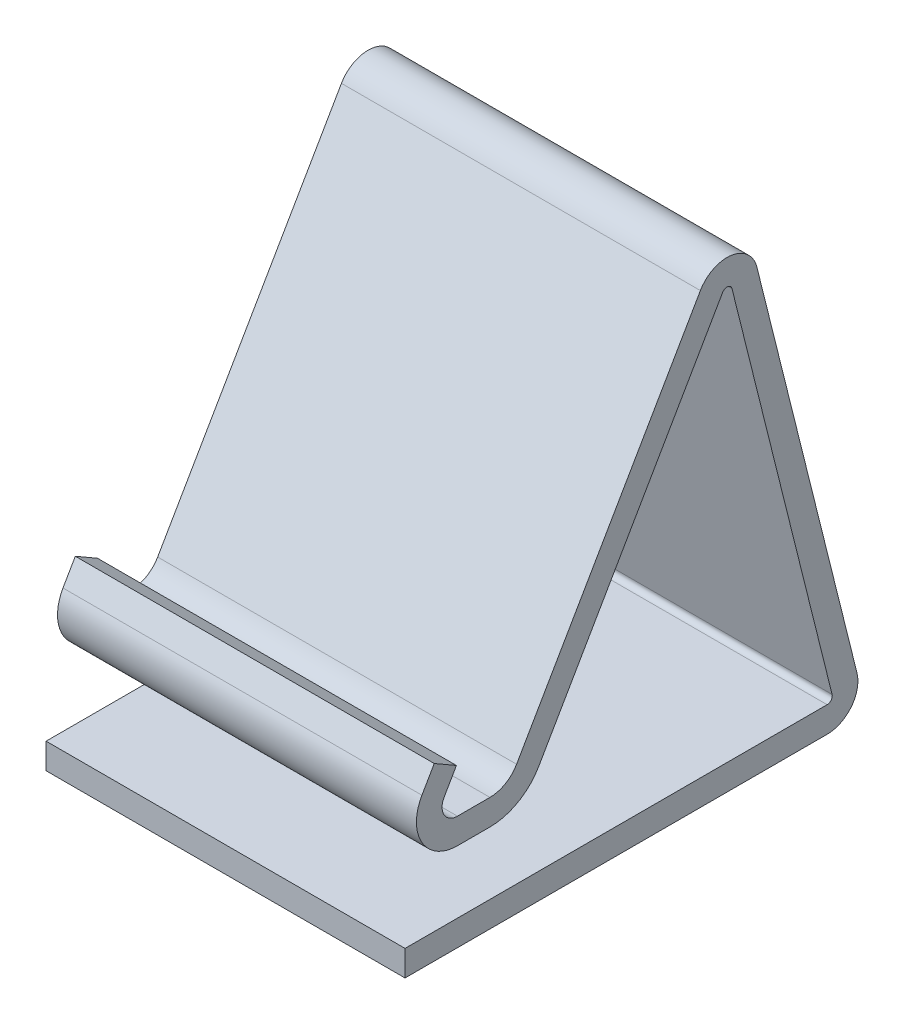
ISO-10303-21;
HEADER;
FILE_DESCRIPTION(('STEP AP214'),'2;1');
FILE_NAME('part.step','',(''),(''),'','','');
FILE_SCHEMA(('AUTOMOTIVE_DESIGN { 1 0 10303 214 1 1 1 1 }'));
ENDSEC;
DATA;
#1=APPLICATION_CONTEXT('core data for automotive mechanical design processes');
#2=APPLICATION_PROTOCOL_DEFINITION('international standard','automotive_design',2000,#1);
#3=PRODUCT_CONTEXT('',#1,'mechanical');
#4=PRODUCT('Part','Part','',(#3));
#5=PRODUCT_RELATED_PRODUCT_CATEGORY('part','',(#4));
#6=PRODUCT_DEFINITION_FORMATION('','',#4);
#7=PRODUCT_DEFINITION_CONTEXT('part definition',#1,'design');
#8=PRODUCT_DEFINITION('design','',#6,#7);
#9=PRODUCT_DEFINITION_SHAPE('','',#8);
#10=(LENGTH_UNIT() NAMED_UNIT(*) SI_UNIT(.MILLI.,.METRE.));
#11=(NAMED_UNIT(*) PLANE_ANGLE_UNIT() SI_UNIT($,.RADIAN.));
#12=(NAMED_UNIT(*) SI_UNIT($,.STERADIAN.) SOLID_ANGLE_UNIT());
#13=UNCERTAINTY_MEASURE_WITH_UNIT(LENGTH_MEASURE(1.E-05),#10,'distance_accuracy_value','');
#14=(GEOMETRIC_REPRESENTATION_CONTEXT(3) GLOBAL_UNCERTAINTY_ASSIGNED_CONTEXT((#13)) GLOBAL_UNIT_ASSIGNED_CONTEXT((#10,
#11,#12)) REPRESENTATION_CONTEXT('',''));
#15=CARTESIAN_POINT('',(0.,0.,0.));
#16=DIRECTION('',(0.,0.,1.));
#17=DIRECTION('',(1.,0.,0.));
#18=AXIS2_PLACEMENT_3D('',#15,#16,#17);
#19=CARTESIAN_POINT('',(70.,9.96390375155059,19.23739578282));
#20=DIRECTION('',(0.,-0.866025403784436,0.500000000000004));
#21=DIRECTION('',(0.,-0.500000000000004,-0.866025403784436));
#22=AXIS2_PLACEMENT_3D('',#19,#20,#21);
#23=PLANE('',#22);
#24=DIRECTION('',(0.,0.500000000000004,0.866025403784436));
#25=VECTOR('',#24,1.);
#26=CARTESIAN_POINT('',(0.,9.96390375155059,19.23739578282));
#27=LINE('',#26,#25);
#28=CARTESIAN_POINT('',(0.,7.4639037515514,14.9072687638993));
#29=VERTEX_POINT('',#28);
#30=CARTESIAN_POINT('',(0.,9.96390375155059,19.23739578282));
#31=VERTEX_POINT('',#30);
#32=EDGE_CURVE('E201',#29,#31,#27,.T.);
#33=ORIENTED_EDGE('',*,*,#32,.T.);
#34=DIRECTION('',(-1.,0.,0.));
#35=VECTOR('',#34,1.);
#36=CARTESIAN_POINT('',(70.,9.96390375155059,19.23739578282));
#37=LINE('',#36,#35);
#38=CARTESIAN_POINT('',(70.,9.96390375155059,19.23739578282));
#39=VERTEX_POINT('',#38);
#40=EDGE_CURVE('E11',#39,#31,#37,.T.);
#41=ORIENTED_EDGE('',*,*,#40,.F.);
#42=DIRECTION('',(0.,0.500000000000004,0.866025403784436));
#43=VECTOR('',#42,1.);
#44=CARTESIAN_POINT('',(70.,9.96390375155059,19.23739578282));
#45=LINE('',#44,#43);
#46=CARTESIAN_POINT('',(70.,7.4639037515514,14.9072687638993));
#47=VERTEX_POINT('',#46);
#48=EDGE_CURVE('E239',#47,#39,#45,.T.);
#49=ORIENTED_EDGE('',*,*,#48,.F.);
#50=DIRECTION('',(-1.,0.,0.));
#51=VECTOR('',#50,1.);
#52=CARTESIAN_POINT('',(70.,7.4639037515514,14.9072687638993));
#53=LINE('',#52,#51);
#54=EDGE_CURVE('E197',#47,#29,#53,.T.);
#55=ORIENTED_EDGE('',*,*,#54,.T.);
#56=EDGE_LOOP('',(#33,#41,#49,#55));
#57=FACE_BOUND('',#56,.T.);
#58=ADVANCED_FACE('F33',(#57),#23,.F.);
#59=CARTESIAN_POINT('',(70.,9.96390375155059,19.23739578282));
#60=DIRECTION('',(0.,-0.500000000000004,-0.866025403784436));
#61=DIRECTION('',(0.,0.866025403784436,-0.500000000000004));
#62=AXIS2_PLACEMENT_3D('',#59,#60,#61);
#63=PLANE('',#62);
#64=DIRECTION('',(0.,-0.866025403784436,0.500000000000004));
#65=VECTOR('',#64,1.);
#66=CARTESIAN_POINT('',(0.,9.96390375155059,19.23739578282));
#67=LINE('',#66,#65);
#68=CARTESIAN_POINT('',(0.,5.80364971370628,21.6393195714667));
#69=VERTEX_POINT('',#68);
#70=EDGE_CURVE('E204',#31,#69,#67,.T.);
#71=ORIENTED_EDGE('',*,*,#70,.T.);
#72=DIRECTION('',(-1.,0.,0.));
#73=VECTOR('',#72,1.);
#74=CARTESIAN_POINT('',(70.,5.80364971370628,21.6393195714667));
#75=LINE('',#74,#73);
#76=CARTESIAN_POINT('',(70.,5.80364971370628,21.6393195714667));
#77=VERTEX_POINT('',#76);
#78=EDGE_CURVE('E41',#77,#69,#75,.T.);
#79=ORIENTED_EDGE('',*,*,#78,.F.);
#80=DIRECTION('',(0.,-0.866025403784436,0.500000000000004));
#81=VECTOR('',#80,1.);
#82=CARTESIAN_POINT('',(70.,9.96390375155059,19.23739578282));
#83=LINE('',#82,#81);
#84=EDGE_CURVE('E128',#39,#77,#83,.T.);
#85=ORIENTED_EDGE('',*,*,#84,.F.);
#86=ORIENTED_EDGE('',*,*,#40,.T.);
#87=EDGE_LOOP('',(#71,#79,#85,#86));
#88=FACE_BOUND('',#87,.T.);
#89=ADVANCED_FACE('F357',(#88),#63,.F.);
#90=CARTESIAN_POINT('',(70.,1.80364971370625,14.7111163411912));
#91=DIRECTION('',(-1.,0.,0.));
#92=DIRECTION('',(0.,0.,1.));
#93=AXIS2_PLACEMENT_3D('',#90,#91,#92);
#94=CYLINDRICAL_SURFACE('',#93,8.);
#95=CARTESIAN_POINT('',(0.,1.80364971370625,14.7111163411912));
#96=DIRECTION('',(1.,0.,0.));
#97=DIRECTION('',(0.,0.,1.));
#98=AXIS2_PLACEMENT_3D('',#95,#96,#97);
#99=CIRCLE('',#98,8.);
#100=CARTESIAN_POINT('',(0.,-6.19635028629375,14.7111163411912));
#101=VERTEX_POINT('',#100);
#102=EDGE_CURVE('E206',#69,#101,#99,.T.);
#103=ORIENTED_EDGE('',*,*,#102,.T.);
#104=DIRECTION('',(-1.,0.,0.));
#105=VECTOR('',#104,1.);
#106=CARTESIAN_POINT('',(70.,-6.19635028629375,14.7111163411912));
#107=LINE('',#106,#105);
#108=CARTESIAN_POINT('',(70.,-6.19635028629375,14.7111163411912));
#109=VERTEX_POINT('',#108);
#110=EDGE_CURVE('E282',#109,#101,#107,.T.);
#111=ORIENTED_EDGE('',*,*,#110,.F.);
#112=CARTESIAN_POINT('',(70.,1.80364971370625,14.7111163411912));
#113=DIRECTION('',(1.,0.,0.));
#114=DIRECTION('',(0.,0.,1.));
#115=AXIS2_PLACEMENT_3D('',#112,#113,#114);
#116=CIRCLE('',#115,8.);
#117=EDGE_CURVE('E290',#77,#109,#116,.T.);
#118=ORIENTED_EDGE('',*,*,#117,.F.);
#119=ORIENTED_EDGE('',*,*,#78,.T.);
#120=EDGE_LOOP('',(#103,#111,#118,#119));
#121=FACE_BOUND('',#120,.T.);
#122=ADVANCED_FACE('F288',(#121),#94,.T.);
#123=CARTESIAN_POINT('',(70.,-6.19635028629375,14.7111163411912));
#124=DIRECTION('',(0.,1.,0.));
#125=DIRECTION('',(0.,0.,1.));
#126=AXIS2_PLACEMENT_3D('',#123,#124,#125);
#127=PLANE('',#126);
#128=DIRECTION('',(0.,0.,-1.));
#129=VECTOR('',#128,1.);
#130=CARTESIAN_POINT('',(0.,-6.19635028629375,14.7111163411912));
#131=LINE('',#130,#129);
#132=CARTESIAN_POINT('',(0.,-6.19635028629362,8.37137037903561));
#133=VERTEX_POINT('',#132);
#134=EDGE_CURVE('E208',#101,#133,#131,.T.);
#135=ORIENTED_EDGE('',*,*,#134,.T.);
#136=DIRECTION('',(-1.,0.,0.));
#137=VECTOR('',#136,1.);
#138=CARTESIAN_POINT('',(70.,-6.19635028629362,8.37137037903561));
#139=LINE('',#138,#137);
#140=CARTESIAN_POINT('',(70.,-6.19635028629362,8.37137037903561));
#141=VERTEX_POINT('',#140);
#142=EDGE_CURVE('E279',#141,#133,#139,.T.);
#143=ORIENTED_EDGE('',*,*,#142,.F.);
#144=DIRECTION('',(0.,0.,-1.));
#145=VECTOR('',#144,1.);
#146=CARTESIAN_POINT('',(70.,-6.19635028629375,14.7111163411912));
#147=LINE('',#146,#145);
#148=EDGE_CURVE('E308',#109,#141,#147,.T.);
#149=ORIENTED_EDGE('',*,*,#148,.F.);
#150=ORIENTED_EDGE('',*,*,#110,.T.);
#151=EDGE_LOOP('',(#135,#143,#149,#150));
#152=FACE_BOUND('',#151,.T.);
#153=ADVANCED_FACE('F299',(#152),#127,.F.);
#154=CARTESIAN_POINT('',(70.,4.80364971370625,8.37137037903561));
#155=DIRECTION('',(-1.,0.,0.));
#156=DIRECTION('',(0.,0.,1.));
#157=AXIS2_PLACEMENT_3D('',#154,#155,#156);
#158=CYLINDRICAL_SURFACE('',#157,10.9999999999999);
#159=CARTESIAN_POINT('',(0.,4.80364971370625,8.37137037903561));
#160=DIRECTION('',(1.,0.,0.));
#161=DIRECTION('',(0.,0.,-1.));
#162=AXIS2_PLACEMENT_3D('',#159,#160,#161);
#163=CIRCLE('',#162,10.9999999999999);
#164=CARTESIAN_POINT('',(0.,-0.696350286293696,-1.15490906259324));
#165=VERTEX_POINT('',#164);
#166=EDGE_CURVE('E210',#133,#165,#163,.T.);
#167=ORIENTED_EDGE('',*,*,#166,.T.);
#168=DIRECTION('',(-1.,0.,0.));
#169=VECTOR('',#168,1.);
#170=CARTESIAN_POINT('',(70.,-0.696350286293696,-1.15490906259324));
#171=LINE('',#170,#169);
#172=CARTESIAN_POINT('',(70.,-0.696350286293696,-1.15490906259324));
#173=VERTEX_POINT('',#172);
#174=EDGE_CURVE('E276',#173,#165,#171,.T.);
#175=ORIENTED_EDGE('',*,*,#174,.F.);
#176=CARTESIAN_POINT('',(70.,4.80364971370625,8.37137037903561));
#177=DIRECTION('',(1.,0.,0.));
#178=DIRECTION('',(0.,0.,-1.));
#179=AXIS2_PLACEMENT_3D('',#176,#177,#178);
#180=CIRCLE('',#179,10.9999999999999);
#181=EDGE_CURVE('E305',#141,#173,#180,.T.);
#182=ORIENTED_EDGE('',*,*,#181,.F.);
#183=ORIENTED_EDGE('',*,*,#142,.T.);
#184=EDGE_LOOP('',(#167,#175,#182,#183));
#185=FACE_BOUND('',#184,.T.);
#186=ADVANCED_FACE('F303',(#185),#158,.T.);
#187=CARTESIAN_POINT('',(70.,-0.696350286293696,-1.15490906259324));
#188=DIRECTION('',(0.,0.499999999999995,0.866025403784442));
#189=DIRECTION('',(0.,-0.866025403784442,0.499999999999995));
#190=AXIS2_PLACEMENT_3D('',#187,#188,#189);
#191=PLANE('',#190);
#192=DIRECTION('',(0.,0.866025403784442,-0.499999999999995));
#193=VECTOR('',#192,1.);
#194=CARTESIAN_POINT('',(0.,-0.696350286293696,-1.15490906259324));
#195=LINE('',#194,#193);
#196=CARTESIAN_POINT('',(0.,61.3850075045175,-36.9975976947751));
#197=VERTEX_POINT('',#196);
#198=EDGE_CURVE('E212',#165,#197,#195,.T.);
#199=ORIENTED_EDGE('',*,*,#198,.T.);
#200=DIRECTION('',(-1.,0.,0.));
#201=VECTOR('',#200,1.);
#202=CARTESIAN_POINT('',(70.,61.3850075045175,-36.9975976947751));
#203=LINE('',#202,#201);
#204=CARTESIAN_POINT('',(70.,61.3850075045175,-36.9975976947751));
#205=VERTEX_POINT('',#204);
#206=EDGE_CURVE('E273',#205,#197,#203,.T.);
#207=ORIENTED_EDGE('',*,*,#206,.F.);
#208=DIRECTION('',(0.,0.866025403784442,-0.499999999999995));
#209=VECTOR('',#208,1.);
#210=CARTESIAN_POINT('',(70.,-0.696350286293696,-1.15490906259324));
#211=LINE('',#210,#209);
#212=EDGE_CURVE('E307',#173,#205,#211,.T.);
#213=ORIENTED_EDGE('',*,*,#212,.F.);
#214=ORIENTED_EDGE('',*,*,#174,.T.);
#215=EDGE_LOOP('',(#199,#207,#213,#214));
#216=FACE_BOUND('',#215,.T.);
#217=ADVANCED_FACE('F370',(#216),#191,.F.);
#218=CARTESIAN_POINT('',(70.,60.8850075045175,-37.8636230985595));
#219=DIRECTION('',(-1.,0.,0.));
#220=DIRECTION('',(0.,0.,1.));
#221=AXIS2_PLACEMENT_3D('',#218,#219,#220);
#222=CYLINDRICAL_SURFACE('',#221,0.999999999999933);
#223=CARTESIAN_POINT('',(0.,60.8850075045175,-37.8636230985595));
#224=DIRECTION('',(-1.,0.,0.));
#225=DIRECTION('',(0.,0.,1.));
#226=AXIS2_PLACEMENT_3D('',#223,#224,#225);
#227=CIRCLE('',#226,0.999999999999933);
#228=CARTESIAN_POINT('',(0.,61.1269294001172,-38.8339188248354));
#229=VERTEX_POINT('',#228);
#230=EDGE_CURVE('E214',#197,#229,#227,.T.);
#231=ORIENTED_EDGE('',*,*,#230,.T.);
#232=DIRECTION('',(-1.,0.,0.));
#233=VECTOR('',#232,1.);
#234=CARTESIAN_POINT('',(70.,61.1269294001172,-38.8339188248354));
#235=LINE('',#234,#233);
#236=CARTESIAN_POINT('',(70.,61.1269294001172,-38.8339188248354));
#237=VERTEX_POINT('',#236);
#238=EDGE_CURVE('E270',#237,#229,#235,.T.);
#239=ORIENTED_EDGE('',*,*,#238,.F.);
#240=CARTESIAN_POINT('',(70.,60.8850075045175,-37.8636230985595));
#241=DIRECTION('',(-1.,0.,0.));
#242=DIRECTION('',(0.,0.,1.));
#243=AXIS2_PLACEMENT_3D('',#240,#241,#242);
#244=CIRCLE('',#243,0.999999999999933);
#245=EDGE_CURVE('E310',#205,#237,#244,.T.);
#246=ORIENTED_EDGE('',*,*,#245,.F.);
#247=ORIENTED_EDGE('',*,*,#206,.T.);
#248=EDGE_LOOP('',(#231,#239,#246,#247));
#249=FACE_BOUND('',#248,.T.);
#250=ADVANCED_FACE('F373',(#249),#222,.F.);
#251=CARTESIAN_POINT('',(70.,61.1269294001172,-38.8339188248354));
#252=DIRECTION('',(0.,0.241921895599669,-0.970295726275996));
#253=DIRECTION('',(0.,0.970295726275996,0.241921895599669));
#254=AXIS2_PLACEMENT_3D('',#251,#252,#253);
#255=PLANE('',#254);
#256=DIRECTION('',(0.,-0.970295726275996,-0.241921895599669));
#257=VECTOR('',#256,1.);
#258=CARTESIAN_POINT('',(0.,61.1269294001172,-38.8339188248354));
#259=LINE('',#258,#257);
#260=CARTESIAN_POINT('',(0.,-17.1767401692914,-58.357216373868));
#261=VERTEX_POINT('',#260);
#262=EDGE_CURVE('E216',#229,#261,#259,.T.);
#263=ORIENTED_EDGE('',*,*,#262,.T.);
#264=DIRECTION('',(-1.,0.,0.));
#265=VECTOR('',#264,1.);
#266=CARTESIAN_POINT('',(70.,-17.1767401692914,-58.357216373868));
#267=LINE('',#266,#265);
#268=CARTESIAN_POINT('',(70.,-17.1767401692914,-58.357216373868));
#269=VERTEX_POINT('',#268);
#270=EDGE_CURVE('E267',#269,#261,#267,.T.);
#271=ORIENTED_EDGE('',*,*,#270,.F.);
#272=DIRECTION('',(0.,-0.970295726275996,-0.241921895599669));
#273=VECTOR('',#272,1.);
#274=CARTESIAN_POINT('',(70.,61.1269294001172,-38.8339188248354));
#275=LINE('',#274,#273);
#276=EDGE_CURVE('E316',#237,#269,#275,.T.);
#277=ORIENTED_EDGE('',*,*,#276,.F.);
#278=ORIENTED_EDGE('',*,*,#238,.T.);
#279=EDGE_LOOP('',(#263,#271,#277,#278));
#280=FACE_BOUND('',#279,.T.);
#281=ADVANCED_FACE('F377',(#280),#255,.F.);
#282=CARTESIAN_POINT('',(70.,-17.4186620648905,-57.3869206475915));
#283=DIRECTION('',(-1.,0.,0.));
#284=DIRECTION('',(0.,0.,1.));
#285=AXIS2_PLACEMENT_3D('',#282,#283,#284);
#286=CYLINDRICAL_SURFACE('',#285,1.00000000000041);
#287=CARTESIAN_POINT('',(0.,-17.4186620648905,-57.3869206475915));
#288=DIRECTION('',(-1.,0.,0.));
#289=DIRECTION('',(0.,0.,-1.));
#290=AXIS2_PLACEMENT_3D('',#287,#288,#289);
#291=CIRCLE('',#290,1.00000000000041);
#292=CARTESIAN_POINT('',(0.,-18.4186620648905,-57.3869206475916));
#293=VERTEX_POINT('',#292);
#294=EDGE_CURVE('E218',#261,#293,#291,.T.);
#295=ORIENTED_EDGE('',*,*,#294,.T.);
#296=DIRECTION('',(-1.,0.,0.));
#297=VECTOR('',#296,1.);
#298=CARTESIAN_POINT('',(70.,-18.4186620648905,-57.3869206475916));
#299=LINE('',#298,#297);
#300=CARTESIAN_POINT('',(70.,-18.4186620648905,-57.3869206475916));
#301=VERTEX_POINT('',#300);
#302=EDGE_CURVE('E264',#301,#293,#299,.T.);
#303=ORIENTED_EDGE('',*,*,#302,.F.);
#304=CARTESIAN_POINT('',(70.,-17.4186620648905,-57.3869206475915));
#305=DIRECTION('',(-1.,0.,0.));
#306=DIRECTION('',(0.,0.,-1.));
#307=AXIS2_PLACEMENT_3D('',#304,#305,#306);
#308=CIRCLE('',#307,1.00000000000041);
#309=EDGE_CURVE('E318',#269,#301,#308,.T.);
#310=ORIENTED_EDGE('',*,*,#309,.F.);
#311=ORIENTED_EDGE('',*,*,#270,.T.);
#312=EDGE_LOOP('',(#295,#303,#310,#311));
#313=FACE_BOUND('',#312,.T.);
#314=ADVANCED_FACE('F381',(#313),#286,.F.);
#315=CARTESIAN_POINT('',(70.,-18.4186620648905,-57.3869206475916));
#316=DIRECTION('',(0.,-1.,0.));
#317=DIRECTION('',(0.,0.,-1.));
#318=AXIS2_PLACEMENT_3D('',#315,#316,#317);
#319=PLANE('',#318);
#320=DIRECTION('',(0.,0.,1.));
#321=VECTOR('',#320,1.);
#322=CARTESIAN_POINT('',(0.,-18.4186620648905,-57.3869206475916));
#323=LINE('',#322,#321);
#324=CARTESIAN_POINT('',(0.,-18.418662064891,24.9334295592486));
#325=VERTEX_POINT('',#324);
#326=EDGE_CURVE('E220',#293,#325,#323,.T.);
#327=ORIENTED_EDGE('',*,*,#326,.T.);
#328=DIRECTION('',(-1.,0.,0.));
#329=VECTOR('',#328,1.);
#330=CARTESIAN_POINT('',(70.,-18.418662064891,24.9334295592486));
#331=LINE('',#330,#329);
#332=CARTESIAN_POINT('',(70.,-18.418662064891,24.9334295592486));
#333=VERTEX_POINT('',#332);
#334=EDGE_CURVE('E261',#333,#325,#331,.T.);
#335=ORIENTED_EDGE('',*,*,#334,.F.);
#336=DIRECTION('',(0.,0.,1.));
#337=VECTOR('',#336,1.);
#338=CARTESIAN_POINT('',(70.,-18.4186620648905,-57.3869206475916));
#339=LINE('',#338,#337);
#340=EDGE_CURVE('E320',#301,#333,#339,.T.);
#341=ORIENTED_EDGE('',*,*,#340,.F.);
#342=ORIENTED_EDGE('',*,*,#302,.T.);
#343=EDGE_LOOP('',(#327,#335,#341,#342));
#344=FACE_BOUND('',#343,.T.);
#345=ADVANCED_FACE('F385',(#344),#319,.F.);
#346=CARTESIAN_POINT('',(70.,-18.418662064891,24.9334295592486));
#347=DIRECTION('',(0.,0.,-1.));
#348=DIRECTION('',(0.,1.,0.));
#349=AXIS2_PLACEMENT_3D('',#346,#347,#348);
#350=PLANE('',#349);
#351=DIRECTION('',(0.,-1.,0.));
#352=VECTOR('',#351,1.);
#353=CARTESIAN_POINT('',(0.,-18.418662064891,24.9334295592486));
#354=LINE('',#353,#352);
#355=CARTESIAN_POINT('',(0.,-23.4186620648913,24.9334295592486));
#356=VERTEX_POINT('',#355);
#357=EDGE_CURVE('E222',#325,#356,#354,.T.);
#358=ORIENTED_EDGE('',*,*,#357,.T.);
#359=DIRECTION('',(-1.,0.,0.));
#360=VECTOR('',#359,1.);
#361=CARTESIAN_POINT('',(70.,-23.4186620648913,24.9334295592486));
#362=LINE('',#361,#360);
#363=CARTESIAN_POINT('',(70.,-23.4186620648913,24.9334295592486));
#364=VERTEX_POINT('',#363);
#365=EDGE_CURVE('E258',#364,#356,#362,.T.);
#366=ORIENTED_EDGE('',*,*,#365,.F.);
#367=DIRECTION('',(0.,-1.,0.));
#368=VECTOR('',#367,1.);
#369=CARTESIAN_POINT('',(70.,-18.418662064891,24.9334295592486));
#370=LINE('',#369,#368);
#371=EDGE_CURVE('E322',#333,#364,#370,.T.);
#372=ORIENTED_EDGE('',*,*,#371,.F.);
#373=ORIENTED_EDGE('',*,*,#334,.T.);
#374=EDGE_LOOP('',(#358,#366,#372,#373));
#375=FACE_BOUND('',#374,.T.);
#376=ADVANCED_FACE('F389',(#375),#350,.F.);
#377=CARTESIAN_POINT('',(70.,-23.418662064891,-57.3869206475925));
#378=DIRECTION('',(0.,1.,0.));
#379=DIRECTION('',(0.,0.,1.));
#380=AXIS2_PLACEMENT_3D('',#377,#378,#379);
#381=PLANE('',#380);
#382=DIRECTION('',(0.,0.,-1.));
#383=VECTOR('',#382,1.);
#384=CARTESIAN_POINT('',(0.,-23.418662064891,-57.3869206475925));
#385=LINE('',#384,#383);
#386=CARTESIAN_POINT('',(0.,-23.4186620648911,-57.3869206475925));
#387=VERTEX_POINT('',#386);
#388=EDGE_CURVE('E224',#356,#387,#385,.T.);
#389=ORIENTED_EDGE('',*,*,#388,.T.);
#390=DIRECTION('',(-1.,0.,0.));
#391=VECTOR('',#390,1.);
#392=CARTESIAN_POINT('',(70.,-23.4186620648911,-57.3869206475925));
#393=LINE('',#392,#391);
#394=CARTESIAN_POINT('',(70.,-23.4186620648911,-57.3869206475925));
#395=VERTEX_POINT('',#394);
#396=EDGE_CURVE('E255',#395,#387,#393,.T.);
#397=ORIENTED_EDGE('',*,*,#396,.F.);
#398=DIRECTION('',(0.,0.,-1.));
#399=VECTOR('',#398,1.);
#400=CARTESIAN_POINT('',(70.,-23.418662064891,-57.3869206475925));
#401=LINE('',#400,#399);
#402=EDGE_CURVE('E324',#364,#395,#401,.T.);
#403=ORIENTED_EDGE('',*,*,#402,.F.);
#404=ORIENTED_EDGE('',*,*,#365,.T.);
#405=EDGE_LOOP('',(#389,#397,#403,#404));
#406=FACE_BOUND('',#405,.T.);
#407=ADVANCED_FACE('F393',(#406),#381,.F.);
#408=CARTESIAN_POINT('',(70.,-17.4186620648905,-57.3869206475915));
#409=DIRECTION('',(-1.,0.,0.));
#410=DIRECTION('',(0.,0.,1.));
#411=AXIS2_PLACEMENT_3D('',#408,#409,#410);
#412=CYLINDRICAL_SURFACE('',#411,6.00000000000066);
#413=CARTESIAN_POINT('',(0.,-17.4186620648905,-57.3869206475915));
#414=DIRECTION('',(1.,0.,0.));
#415=DIRECTION('',(0.,0.,-1.));
#416=AXIS2_PLACEMENT_3D('',#413,#414,#415);
#417=CIRCLE('',#416,6.00000000000066);
#418=CARTESIAN_POINT('',(0.,-15.967130691293,-63.2086950052484));
#419=VERTEX_POINT('',#418);
#420=EDGE_CURVE('E226',#387,#419,#417,.T.);
#421=ORIENTED_EDGE('',*,*,#420,.T.);
#422=DIRECTION('',(-1.,0.,0.));
#423=VECTOR('',#422,1.);
#424=CARTESIAN_POINT('',(70.,-15.967130691293,-63.2086950052484));
#425=LINE('',#424,#423);
#426=CARTESIAN_POINT('',(70.,-15.967130691293,-63.2086950052484));
#427=VERTEX_POINT('',#426);
#428=EDGE_CURVE('E252',#427,#419,#425,.T.);
#429=ORIENTED_EDGE('',*,*,#428,.F.);
#430=CARTESIAN_POINT('',(70.,-17.4186620648905,-57.3869206475915));
#431=DIRECTION('',(1.,0.,0.));
#432=DIRECTION('',(0.,0.,-1.));
#433=AXIS2_PLACEMENT_3D('',#430,#431,#432);
#434=CIRCLE('',#433,6.00000000000066);
#435=EDGE_CURVE('E326',#395,#427,#434,.T.);
#436=ORIENTED_EDGE('',*,*,#435,.F.);
#437=ORIENTED_EDGE('',*,*,#396,.T.);
#438=EDGE_LOOP('',(#421,#429,#436,#437));
#439=FACE_BOUND('',#438,.T.);
#440=ADVANCED_FACE('F397',(#439),#412,.T.);
#441=CARTESIAN_POINT('',(70.,62.3365388781156,-43.6853974562155));
#442=DIRECTION('',(0.,-0.241921895599668,0.970295726275996));
#443=DIRECTION('',(0.,-0.970295726275997,-0.241921895599668));
#444=AXIS2_PLACEMENT_3D('',#441,#442,#443);
#445=PLANE('',#444);
#446=DIRECTION('',(0.,0.970295726275996,0.241921895599667));
#447=VECTOR('',#446,1.);
#448=CARTESIAN_POINT('',(0.,62.3365388781156,-43.6853974562155));
#449=LINE('',#448,#447);
#450=CARTESIAN_POINT('',(0.,62.3365388781152,-43.6853974562141));
#451=VERTEX_POINT('',#450);
#452=EDGE_CURVE('E228',#419,#451,#449,.T.);
#453=ORIENTED_EDGE('',*,*,#452,.T.);
#454=DIRECTION('',(-1.,0.,0.));
#455=VECTOR('',#454,1.);
#456=CARTESIAN_POINT('',(70.,62.3365388781152,-43.6853974562141));
#457=LINE('',#456,#455);
#458=CARTESIAN_POINT('',(70.,62.3365388781152,-43.6853974562141));
#459=VERTEX_POINT('',#458);
#460=EDGE_CURVE('E249',#459,#451,#457,.T.);
#461=ORIENTED_EDGE('',*,*,#460,.F.);
#462=DIRECTION('',(0.,0.970295726275996,0.241921895599667));
#463=VECTOR('',#462,1.);
#464=CARTESIAN_POINT('',(70.,62.3365388781156,-43.6853974562155));
#465=LINE('',#464,#463);
#466=EDGE_CURVE('E328',#427,#459,#465,.T.);
#467=ORIENTED_EDGE('',*,*,#466,.F.);
#468=ORIENTED_EDGE('',*,*,#428,.T.);
#469=EDGE_LOOP('',(#453,#461,#467,#468));
#470=FACE_BOUND('',#469,.T.);
#471=ADVANCED_FACE('F401',(#470),#445,.F.);
#472=CARTESIAN_POINT('',(70.,60.8850075045183,-37.863623098558));
#473=DIRECTION('',(-1.,0.,0.));
#474=DIRECTION('',(0.,0.,1.));
#475=AXIS2_PLACEMENT_3D('',#472,#473,#474);
#476=CYLINDRICAL_SURFACE('',#475,5.99999999999978);
#477=CARTESIAN_POINT('',(0.,60.8850075045183,-37.863623098558));
#478=DIRECTION('',(1.,0.,0.));
#479=DIRECTION('',(0.,0.,1.));
#480=AXIS2_PLACEMENT_3D('',#477,#478,#479);
#481=CIRCLE('',#480,5.99999999999978);
#482=CARTESIAN_POINT('',(0.,63.8850075045175,-32.6674706758528));
#483=VERTEX_POINT('',#482);
#484=EDGE_CURVE('E230',#451,#483,#481,.T.);
#485=ORIENTED_EDGE('',*,*,#484,.T.);
#486=DIRECTION('',(-1.,0.,0.));
#487=VECTOR('',#486,1.);
#488=CARTESIAN_POINT('',(70.,63.8850075045175,-32.6674706758528));
#489=LINE('',#488,#487);
#490=CARTESIAN_POINT('',(70.,63.8850075045175,-32.6674706758528));
#491=VERTEX_POINT('',#490);
#492=EDGE_CURVE('E246',#491,#483,#489,.T.);
#493=ORIENTED_EDGE('',*,*,#492,.F.);
#494=CARTESIAN_POINT('',(70.,60.8850075045183,-37.863623098558));
#495=DIRECTION('',(1.,0.,0.));
#496=DIRECTION('',(0.,0.,1.));
#497=AXIS2_PLACEMENT_3D('',#494,#495,#496);
#498=CIRCLE('',#497,5.99999999999978);
#499=EDGE_CURVE('E330',#459,#491,#498,.T.);
#500=ORIENTED_EDGE('',*,*,#499,.F.);
#501=ORIENTED_EDGE('',*,*,#460,.T.);
#502=EDGE_LOOP('',(#485,#493,#500,#501));
#503=FACE_BOUND('',#502,.T.);
#504=ADVANCED_FACE('F405',(#503),#476,.T.);
#505=CARTESIAN_POINT('',(70.,1.80364971370628,3.17521795632896));
#506=DIRECTION('',(0.,-0.499999999999994,-0.866025403784442));
#507=DIRECTION('',(0.,0.866025403784442,-0.499999999999995));
#508=AXIS2_PLACEMENT_3D('',#505,#506,#507);
#509=PLANE('',#508);
#510=DIRECTION('',(0.,-0.866025403784442,0.499999999999994));
#511=VECTOR('',#510,1.);
#512=CARTESIAN_POINT('',(0.,1.80364971370628,3.17521795632896));
#513=LINE('',#512,#511);
#514=CARTESIAN_POINT('',(0.,1.80364971370641,3.17521795632919));
#515=VERTEX_POINT('',#514);
#516=EDGE_CURVE('E232',#483,#515,#513,.T.);
#517=ORIENTED_EDGE('',*,*,#516,.T.);
#518=DIRECTION('',(-1.,0.,0.));
#519=VECTOR('',#518,1.);
#520=CARTESIAN_POINT('',(70.,1.80364971370641,3.17521795632919));
#521=LINE('',#520,#519);
#522=CARTESIAN_POINT('',(70.,1.80364971370641,3.17521795632919));
#523=VERTEX_POINT('',#522);
#524=EDGE_CURVE('E243',#523,#515,#521,.T.);
#525=ORIENTED_EDGE('',*,*,#524,.F.);
#526=DIRECTION('',(0.,-0.866025403784442,0.499999999999994));
#527=VECTOR('',#526,1.);
#528=CARTESIAN_POINT('',(70.,1.80364971370628,3.17521795632896));
#529=LINE('',#528,#527);
#530=EDGE_CURVE('E332',#491,#523,#529,.T.);
#531=ORIENTED_EDGE('',*,*,#530,.F.);
#532=ORIENTED_EDGE('',*,*,#492,.T.);
#533=EDGE_LOOP('',(#517,#525,#531,#532));
#534=FACE_BOUND('',#533,.T.);
#535=ADVANCED_FACE('F338',(#534),#509,.F.);
#536=CARTESIAN_POINT('',(70.,4.8036497137068,8.37137037903654));
#537=DIRECTION('',(-1.,0.,0.));
#538=DIRECTION('',(0.,0.,1.));
#539=AXIS2_PLACEMENT_3D('',#536,#537,#538);
#540=CYLINDRICAL_SURFACE('',#539,6.00000000000082);
#541=CARTESIAN_POINT('',(0.,4.8036497137068,8.37137037903654));
#542=DIRECTION('',(-1.,0.,0.));
#543=DIRECTION('',(0.,0.,-1.));
#544=AXIS2_PLACEMENT_3D('',#541,#542,#543);
#545=CIRCLE('',#544,6.00000000000082);
#546=CARTESIAN_POINT('',(0.,-1.19635028629375,8.37137037903561));
#547=VERTEX_POINT('',#546);
#548=EDGE_CURVE('E234',#515,#547,#545,.T.);
#549=ORIENTED_EDGE('',*,*,#548,.T.);
#550=DIRECTION('',(-1.,0.,0.));
#551=VECTOR('',#550,1.);
#552=CARTESIAN_POINT('',(70.,-1.19635028629375,8.37137037903561));
#553=LINE('',#552,#551);
#554=CARTESIAN_POINT('',(70.,-1.19635028629375,8.37137037903561));
#555=VERTEX_POINT('',#554);
#556=EDGE_CURVE('E192',#555,#547,#553,.T.);
#557=ORIENTED_EDGE('',*,*,#556,.F.);
#558=CARTESIAN_POINT('',(70.,4.8036497137068,8.37137037903654));
#559=DIRECTION('',(-1.,0.,0.));
#560=DIRECTION('',(0.,0.,-1.));
#561=AXIS2_PLACEMENT_3D('',#558,#559,#560);
#562=CIRCLE('',#561,6.00000000000082);
#563=EDGE_CURVE('E183',#523,#555,#562,.T.);
#564=ORIENTED_EDGE('',*,*,#563,.F.);
#565=ORIENTED_EDGE('',*,*,#524,.T.);
#566=EDGE_LOOP('',(#549,#557,#564,#565));
#567=FACE_BOUND('',#566,.T.);
#568=ADVANCED_FACE('F342',(#567),#540,.F.);
#569=CARTESIAN_POINT('',(70.,-1.19635028629375,14.7111163411912));
#570=DIRECTION('',(0.,-1.,0.));
#571=DIRECTION('',(0.,0.,-1.));
#572=AXIS2_PLACEMENT_3D('',#569,#570,#571);
#573=PLANE('',#572);
#574=DIRECTION('',(0.,0.,1.));
#575=VECTOR('',#574,1.);
#576=CARTESIAN_POINT('',(0.,-1.19635028629375,14.7111163411912));
#577=LINE('',#576,#575);
#578=CARTESIAN_POINT('',(0.,-1.19635028629305,14.7111163411912));
#579=VERTEX_POINT('',#578);
#580=EDGE_CURVE('E191',#547,#579,#577,.T.);
#581=ORIENTED_EDGE('',*,*,#580,.T.);
#582=DIRECTION('',(-1.,0.,0.));
#583=VECTOR('',#582,1.);
#584=CARTESIAN_POINT('',(70.,-1.19635028629305,14.7111163411912));
#585=LINE('',#584,#583);
#586=CARTESIAN_POINT('',(70.,-1.19635028629305,14.7111163411912));
#587=VERTEX_POINT('',#586);
#588=EDGE_CURVE('E188',#587,#579,#585,.T.);
#589=ORIENTED_EDGE('',*,*,#588,.F.);
#590=DIRECTION('',(0.,0.,1.));
#591=VECTOR('',#590,1.);
#592=CARTESIAN_POINT('',(70.,-1.19635028629375,14.7111163411912));
#593=LINE('',#592,#591);
#594=EDGE_CURVE('E177',#555,#587,#593,.T.);
#595=ORIENTED_EDGE('',*,*,#594,.F.);
#596=ORIENTED_EDGE('',*,*,#556,.T.);
#597=EDGE_LOOP('',(#581,#589,#595,#596));
#598=FACE_BOUND('',#597,.T.);
#599=ADVANCED_FACE('F189',(#598),#573,.F.);
#600=CARTESIAN_POINT('',(70.,1.80364971370651,14.7111163411923));
#601=DIRECTION('',(-1.,0.,0.));
#602=DIRECTION('',(0.,0.,1.));
#603=AXIS2_PLACEMENT_3D('',#600,#601,#602);
#604=CYLINDRICAL_SURFACE('',#603,2.99999999999957);
#605=CARTESIAN_POINT('',(0.,1.80364971370651,14.7111163411923));
#606=DIRECTION('',(-1.,0.,0.));
#607=DIRECTION('',(0.,0.,1.));
#608=AXIS2_PLACEMENT_3D('',#605,#606,#607);
#609=CIRCLE('',#608,2.99999999999957);
#610=CARTESIAN_POINT('',(0.,3.30364971370626,17.3091925525445));
#611=VERTEX_POINT('',#610);
#612=EDGE_CURVE('E114',#579,#611,#609,.T.);
#613=ORIENTED_EDGE('',*,*,#612,.T.);
#614=DIRECTION('',(-1.,0.,0.));
#615=VECTOR('',#614,1.);
#616=CARTESIAN_POINT('',(70.,3.30364971370626,17.3091925525445));
#617=LINE('',#616,#615);
#618=CARTESIAN_POINT('',(70.,3.30364971370626,17.3091925525445));
#619=VERTEX_POINT('',#618);
#620=EDGE_CURVE('E193',#619,#611,#617,.T.);
#621=ORIENTED_EDGE('',*,*,#620,.F.);
#622=CARTESIAN_POINT('',(70.,1.80364971370651,14.7111163411923));
#623=DIRECTION('',(-1.,0.,0.));
#624=DIRECTION('',(0.,0.,1.));
#625=AXIS2_PLACEMENT_3D('',#622,#623,#624);
#626=CIRCLE('',#625,2.99999999999957);
#627=EDGE_CURVE('E181',#587,#619,#626,.T.);
#628=ORIENTED_EDGE('',*,*,#627,.F.);
#629=ORIENTED_EDGE('',*,*,#588,.T.);
#630=EDGE_LOOP('',(#613,#621,#628,#629));
#631=FACE_BOUND('',#630,.T.);
#632=ADVANCED_FACE('F195',(#631),#604,.F.);
#633=CARTESIAN_POINT('',(70.,7.4639037515514,14.9072687638993));
#634=DIRECTION('',(0.,0.499999999999703,0.86602540378461));
#635=DIRECTION('',(0.,-0.86602540378461,0.499999999999703));
#636=AXIS2_PLACEMENT_3D('',#633,#634,#635);
#637=PLANE('',#636);
#638=DIRECTION('',(0.,0.86602540378461,-0.499999999999703));
#639=VECTOR('',#638,1.);
#640=CARTESIAN_POINT('',(0.,7.4639037515514,14.9072687638993));
#641=LINE('',#640,#639);
#642=EDGE_CURVE('E120',#611,#29,#641,.T.);
#643=ORIENTED_EDGE('',*,*,#642,.T.);
#644=ORIENTED_EDGE('',*,*,#54,.F.);
#645=DIRECTION('',(0.,0.86602540378461,-0.499999999999703));
#646=VECTOR('',#645,1.);
#647=CARTESIAN_POINT('',(70.,7.4639037515514,14.9072687638993));
#648=LINE('',#647,#646);
#649=EDGE_CURVE('E49',#619,#47,#648,.T.);
#650=ORIENTED_EDGE('',*,*,#649,.F.);
#651=ORIENTED_EDGE('',*,*,#620,.T.);
#652=EDGE_LOOP('',(#643,#644,#650,#651));
#653=FACE_BOUND('',#652,.T.);
#654=ADVANCED_FACE('F346',(#653),#637,.F.);
#655=CARTESIAN_POINT('',(70.,1.80364971370651,14.7111163411923));
#656=DIRECTION('',(-1.,0.,0.));
#657=DIRECTION('',(0.,0.,1.));
#658=AXIS2_PLACEMENT_3D('',#655,#656,#657);
#659=PLANE('',#658);
#660=ORIENTED_EDGE('',*,*,#48,.T.);
#661=ORIENTED_EDGE('',*,*,#84,.T.);
#662=ORIENTED_EDGE('',*,*,#117,.T.);
#663=ORIENTED_EDGE('',*,*,#148,.T.);
#664=ORIENTED_EDGE('',*,*,#181,.T.);
#665=ORIENTED_EDGE('',*,*,#212,.T.);
#666=ORIENTED_EDGE('',*,*,#245,.T.);
#667=ORIENTED_EDGE('',*,*,#276,.T.);
#668=ORIENTED_EDGE('',*,*,#309,.T.);
#669=ORIENTED_EDGE('',*,*,#340,.T.);
#670=ORIENTED_EDGE('',*,*,#371,.T.);
#671=ORIENTED_EDGE('',*,*,#402,.T.);
#672=ORIENTED_EDGE('',*,*,#435,.T.);
#673=ORIENTED_EDGE('',*,*,#466,.T.);
#674=ORIENTED_EDGE('',*,*,#499,.T.);
#675=ORIENTED_EDGE('',*,*,#530,.T.);
#676=ORIENTED_EDGE('',*,*,#563,.T.);
#677=ORIENTED_EDGE('',*,*,#594,.T.);
#678=ORIENTED_EDGE('',*,*,#627,.T.);
#679=ORIENTED_EDGE('',*,*,#649,.T.);
#680=EDGE_LOOP('',(#660,#661,#662,#663,#664,#665,#666,#667,#668,#669,#670,#671,#672,#673,#674,
#675,#676,#677,#678,#679));
#681=FACE_BOUND('',#680,.T.);
#682=ADVANCED_FACE('F179',(#681),#659,.F.);
#683=CARTESIAN_POINT('',(0.,1.80364971370651,14.7111163411923));
#684=DIRECTION('',(-1.,0.,0.));
#685=DIRECTION('',(0.,0.,1.));
#686=AXIS2_PLACEMENT_3D('',#683,#684,#685);
#687=PLANE('',#686);
#688=ORIENTED_EDGE('',*,*,#32,.F.);
#689=ORIENTED_EDGE('',*,*,#642,.F.);
#690=ORIENTED_EDGE('',*,*,#612,.F.);
#691=ORIENTED_EDGE('',*,*,#580,.F.);
#692=ORIENTED_EDGE('',*,*,#548,.F.);
#693=ORIENTED_EDGE('',*,*,#516,.F.);
#694=ORIENTED_EDGE('',*,*,#484,.F.);
#695=ORIENTED_EDGE('',*,*,#452,.F.);
#696=ORIENTED_EDGE('',*,*,#420,.F.);
#697=ORIENTED_EDGE('',*,*,#388,.F.);
#698=ORIENTED_EDGE('',*,*,#357,.F.);
#699=ORIENTED_EDGE('',*,*,#326,.F.);
#700=ORIENTED_EDGE('',*,*,#294,.F.);
#701=ORIENTED_EDGE('',*,*,#262,.F.);
#702=ORIENTED_EDGE('',*,*,#230,.F.);
#703=ORIENTED_EDGE('',*,*,#198,.F.);
#704=ORIENTED_EDGE('',*,*,#166,.F.);
#705=ORIENTED_EDGE('',*,*,#134,.F.);
#706=ORIENTED_EDGE('',*,*,#102,.F.);
#707=ORIENTED_EDGE('',*,*,#70,.F.);
#708=EDGE_LOOP('',(#688,#689,#690,#691,#692,#693,#694,#695,#696,#697,#698,#699,#700,#701,#702,
#703,#704,#705,#706,#707));
#709=FACE_BOUND('',#708,.T.);
#710=ADVANCED_FACE('F294',(#709),#687,.T.);
#711=CLOSED_SHELL('',(#58,#89,#122,#153,#186,#217,#250,#281,#314,#345,#376,#407,#440,#471,#504,
#535,#568,#599,#632,#654,#682,#710));
#712=MANIFOLD_SOLID_BREP('B2',#711);
#713=ADVANCED_BREP_SHAPE_REPRESENTATION('',(#18,#712),#14);
#714=SHAPE_DEFINITION_REPRESENTATION(#9,#713);
ENDSEC;
END-ISO-10303-21;
